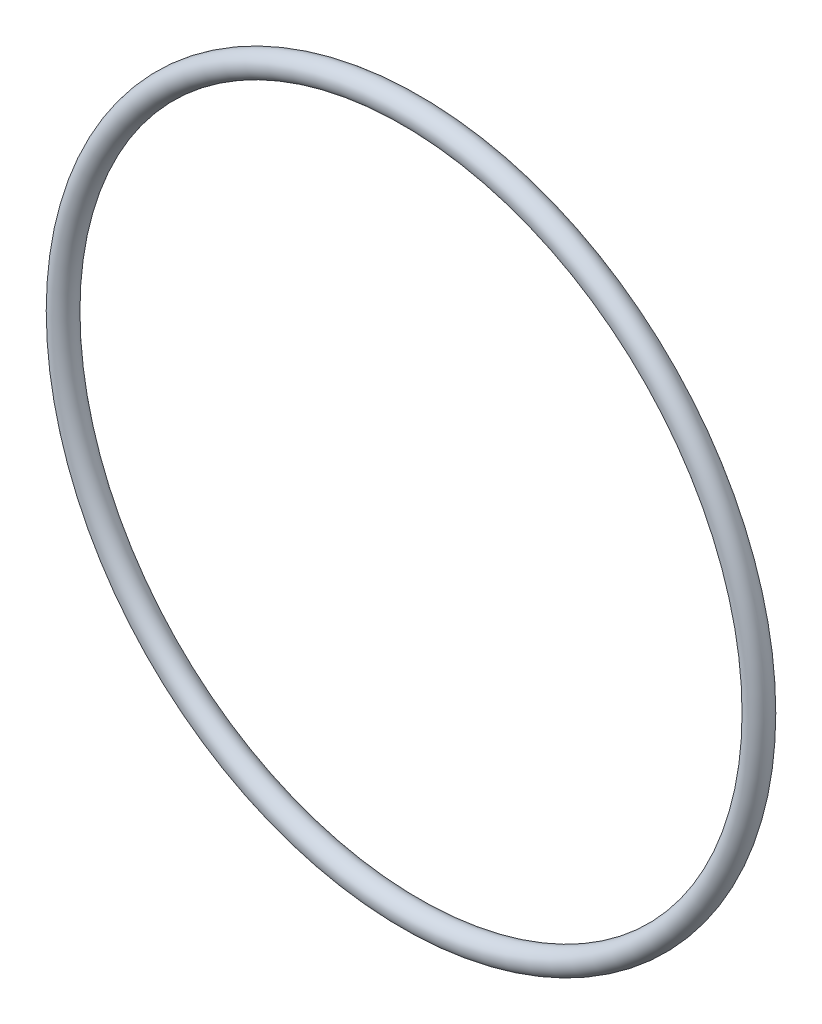
ISO-10303-21;
HEADER;
FILE_DESCRIPTION(('STEP AP214'),'2;1');
FILE_NAME('part.step','',(''),(''),'','','');
FILE_SCHEMA(('AUTOMOTIVE_DESIGN { 1 0 10303 214 1 1 1 1 }'));
ENDSEC;
DATA;
#1=APPLICATION_CONTEXT('core data for automotive mechanical design processes');
#2=APPLICATION_PROTOCOL_DEFINITION('international standard','automotive_design',2000,#1);
#3=PRODUCT_CONTEXT('',#1,'mechanical');
#4=PRODUCT('Part','Part','',(#3));
#5=PRODUCT_RELATED_PRODUCT_CATEGORY('part','',(#4));
#6=PRODUCT_DEFINITION_FORMATION('','',#4);
#7=PRODUCT_DEFINITION_CONTEXT('part definition',#1,'design');
#8=PRODUCT_DEFINITION('design','',#6,#7);
#9=PRODUCT_DEFINITION_SHAPE('','',#8);
#10=(LENGTH_UNIT() NAMED_UNIT(*) SI_UNIT(.MILLI.,.METRE.));
#11=(NAMED_UNIT(*) PLANE_ANGLE_UNIT() SI_UNIT($,.RADIAN.));
#12=(NAMED_UNIT(*) SI_UNIT($,.STERADIAN.) SOLID_ANGLE_UNIT());
#13=UNCERTAINTY_MEASURE_WITH_UNIT(LENGTH_MEASURE(1.E-05),#10,'distance_accuracy_value','');
#14=(GEOMETRIC_REPRESENTATION_CONTEXT(3) GLOBAL_UNCERTAINTY_ASSIGNED_CONTEXT((#13)) GLOBAL_UNIT_ASSIGNED_CONTEXT((#10,
#11,#12)) REPRESENTATION_CONTEXT('',''));
#15=CARTESIAN_POINT('',(0.,0.,0.));
#16=DIRECTION('',(0.,0.,1.));
#17=DIRECTION('',(1.,0.,0.));
#18=AXIS2_PLACEMENT_3D('',#15,#16,#17);
#19=CARTESIAN_POINT('',(0.,0.,0.));
#20=DIRECTION('',(0.,0.,1.));
#21=DIRECTION('',(1.,0.,0.));
#22=AXIS2_PLACEMENT_3D('',#19,#20,#21);
#23=TOROIDAL_SURFACE('',#22,44.45,1.524);
#24=CARTESIAN_POINT('',(44.45,0.,0.));
#25=DIRECTION('',(0.,1.,0.));
#26=DIRECTION('',(-1.,0.,0.));
#27=AXIS2_PLACEMENT_3D('',#24,#25,#26);
#28=CIRCLE('',#27,1.524);
#29=CARTESIAN_POINT('',(45.974,0.,0.));
#30=VERTEX_POINT('',#29);
#31=EDGE_CURVE('E11',#30,#30,#28,.T.);
#32=CARTESIAN_POINT('',(0.,0.,0.));
#33=DIRECTION('',(0.,0.,1.));
#34=DIRECTION('',(1.,0.,0.));
#35=AXIS2_PLACEMENT_3D('',#32,#33,#34);
#36=CIRCLE('',#35,45.974);
#37=EDGE_CURVE('',#30,#30,#36,.T.);
#38=ORIENTED_EDGE('',*,*,#31,.T.);
#39=ORIENTED_EDGE('',*,*,#31,.F.);
#40=ORIENTED_EDGE('',*,*,#37,.T.);
#41=ORIENTED_EDGE('',*,*,#37,.F.);
#42=EDGE_LOOP('',(#38,#40,#39,#41));
#43=FACE_BOUND('',#42,.T.);
#44=ADVANCED_FACE('F46',(#43),#23,.T.);
#45=CLOSED_SHELL('',(#44));
#46=MANIFOLD_SOLID_BREP('B2',#45);
#47=ADVANCED_BREP_SHAPE_REPRESENTATION('',(#18,#46),#14);
#48=SHAPE_DEFINITION_REPRESENTATION(#9,#47);
ENDSEC;
END-ISO-10303-21;
